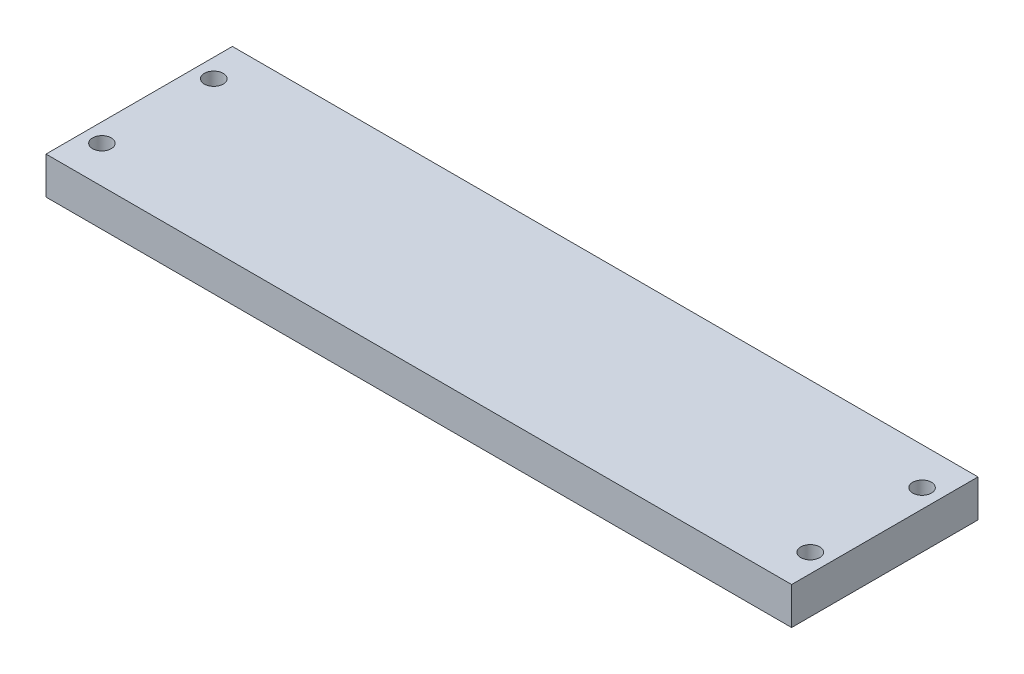
ISO-10303-21;
HEADER;
FILE_DESCRIPTION(('STEP AP214'),'2;1');
FILE_NAME('part.step','',(''),(''),'','','');
FILE_SCHEMA(('AUTOMOTIVE_DESIGN { 1 0 10303 214 1 1 1 1 }'));
ENDSEC;
DATA;
#1=APPLICATION_CONTEXT('core data for automotive mechanical design processes');
#2=APPLICATION_PROTOCOL_DEFINITION('international standard','automotive_design',2000,#1);
#3=PRODUCT_CONTEXT('',#1,'mechanical');
#4=PRODUCT('Part','Part','',(#3));
#5=PRODUCT_RELATED_PRODUCT_CATEGORY('part','',(#4));
#6=PRODUCT_DEFINITION_FORMATION('','',#4);
#7=PRODUCT_DEFINITION_CONTEXT('part definition',#1,'design');
#8=PRODUCT_DEFINITION('design','',#6,#7);
#9=PRODUCT_DEFINITION_SHAPE('','',#8);
#10=(LENGTH_UNIT() NAMED_UNIT(*) SI_UNIT(.MILLI.,.METRE.));
#11=(NAMED_UNIT(*) PLANE_ANGLE_UNIT() SI_UNIT($,.RADIAN.));
#12=(NAMED_UNIT(*) SI_UNIT($,.STERADIAN.) SOLID_ANGLE_UNIT());
#13=UNCERTAINTY_MEASURE_WITH_UNIT(LENGTH_MEASURE(1.E-05),#10,'distance_accuracy_value','');
#14=(GEOMETRIC_REPRESENTATION_CONTEXT(3) GLOBAL_UNCERTAINTY_ASSIGNED_CONTEXT((#13)) GLOBAL_UNIT_ASSIGNED_CONTEXT((#10,
#11,#12)) REPRESENTATION_CONTEXT('',''));
#15=CARTESIAN_POINT('',(0.,0.,0.));
#16=DIRECTION('',(0.,0.,1.));
#17=DIRECTION('',(1.,0.,0.));
#18=AXIS2_PLACEMENT_3D('',#15,#16,#17);
#19=CARTESIAN_POINT('',(63.5,3.175,15.875));
#20=DIRECTION('',(-1.,0.,0.));
#21=DIRECTION('',(0.,0.,1.));
#22=AXIS2_PLACEMENT_3D('',#19,#20,#21);
#23=PLANE('',#22);
#24=DIRECTION('',(0.,0.,-1.));
#25=VECTOR('',#24,1.);
#26=CARTESIAN_POINT('',(63.5,-3.175,15.875));
#27=LINE('',#26,#25);
#28=CARTESIAN_POINT('',(63.5,-3.175,15.875));
#29=VERTEX_POINT('',#28);
#30=CARTESIAN_POINT('',(63.5,-3.175,-15.875));
#31=VERTEX_POINT('',#30);
#32=EDGE_CURVE('E105',#29,#31,#27,.T.);
#33=ORIENTED_EDGE('',*,*,#32,.T.);
#34=DIRECTION('',(0.,-1.,0.));
#35=VECTOR('',#34,1.);
#36=CARTESIAN_POINT('',(63.5,3.175,-15.875));
#37=LINE('',#36,#35);
#38=CARTESIAN_POINT('',(63.5,3.175,-15.875));
#39=VERTEX_POINT('',#38);
#40=EDGE_CURVE('E11',#39,#31,#37,.T.);
#41=ORIENTED_EDGE('',*,*,#40,.F.);
#42=DIRECTION('',(0.,0.,-1.));
#43=VECTOR('',#42,1.);
#44=CARTESIAN_POINT('',(63.5,3.175,15.875));
#45=LINE('',#44,#43);
#46=CARTESIAN_POINT('',(63.5,3.175,15.875));
#47=VERTEX_POINT('',#46);
#48=EDGE_CURVE('E91',#47,#39,#45,.T.);
#49=ORIENTED_EDGE('',*,*,#48,.F.);
#50=DIRECTION('',(0.,-1.,0.));
#51=VECTOR('',#50,1.);
#52=CARTESIAN_POINT('',(63.5,3.175,15.875));
#53=LINE('',#52,#51);
#54=EDGE_CURVE('E101',#47,#29,#53,.T.);
#55=ORIENTED_EDGE('',*,*,#54,.T.);
#56=EDGE_LOOP('',(#33,#41,#49,#55));
#57=FACE_BOUND('',#56,.T.);
#58=ADVANCED_FACE('F38',(#57),#23,.F.);
#59=CARTESIAN_POINT('',(-63.5,3.175,-15.875));
#60=DIRECTION('',(0.,0.,1.));
#61=DIRECTION('',(1.,0.,0.));
#62=AXIS2_PLACEMENT_3D('',#59,#60,#61);
#63=PLANE('',#62);
#64=DIRECTION('',(-1.,0.,0.));
#65=VECTOR('',#64,1.);
#66=CARTESIAN_POINT('',(-63.5,-3.175,-15.875));
#67=LINE('',#66,#65);
#68=CARTESIAN_POINT('',(-63.5,-3.175,-15.875));
#69=VERTEX_POINT('',#68);
#70=EDGE_CURVE('E95',#31,#69,#67,.T.);
#71=ORIENTED_EDGE('',*,*,#70,.T.);
#72=DIRECTION('',(0.,-1.,0.));
#73=VECTOR('',#72,1.);
#74=CARTESIAN_POINT('',(-63.5,3.175,-15.875));
#75=LINE('',#74,#73);
#76=CARTESIAN_POINT('',(-63.5,3.175,-15.875));
#77=VERTEX_POINT('',#76);
#78=EDGE_CURVE('E47',#77,#69,#75,.T.);
#79=ORIENTED_EDGE('',*,*,#78,.F.);
#80=DIRECTION('',(-1.,0.,0.));
#81=VECTOR('',#80,1.);
#82=CARTESIAN_POINT('',(-63.5,3.175,-15.875));
#83=LINE('',#82,#81);
#84=EDGE_CURVE('E86',#39,#77,#83,.T.);
#85=ORIENTED_EDGE('',*,*,#84,.F.);
#86=ORIENTED_EDGE('',*,*,#40,.T.);
#87=EDGE_LOOP('',(#71,#79,#85,#86));
#88=FACE_BOUND('',#87,.T.);
#89=ADVANCED_FACE('F94',(#88),#63,.F.);
#90=CARTESIAN_POINT('',(-63.5,3.175,15.875));
#91=DIRECTION('',(1.,0.,0.));
#92=DIRECTION('',(0.,0.,-1.));
#93=AXIS2_PLACEMENT_3D('',#90,#91,#92);
#94=PLANE('',#93);
#95=DIRECTION('',(0.,0.,1.));
#96=VECTOR('',#95,1.);
#97=CARTESIAN_POINT('',(-63.5,-3.175,15.875));
#98=LINE('',#97,#96);
#99=CARTESIAN_POINT('',(-63.5,-3.175,15.875));
#100=VERTEX_POINT('',#99);
#101=EDGE_CURVE('E73',#69,#100,#98,.T.);
#102=ORIENTED_EDGE('',*,*,#101,.T.);
#103=DIRECTION('',(0.,-1.,0.));
#104=VECTOR('',#103,1.);
#105=CARTESIAN_POINT('',(-63.5,3.175,15.875));
#106=LINE('',#105,#104);
#107=CARTESIAN_POINT('',(-63.5,3.175,15.875));
#108=VERTEX_POINT('',#107);
#109=EDGE_CURVE('E96',#108,#100,#106,.T.);
#110=ORIENTED_EDGE('',*,*,#109,.F.);
#111=DIRECTION('',(0.,0.,1.));
#112=VECTOR('',#111,1.);
#113=CARTESIAN_POINT('',(-63.5,3.175,15.875));
#114=LINE('',#113,#112);
#115=EDGE_CURVE('E89',#77,#108,#114,.T.);
#116=ORIENTED_EDGE('',*,*,#115,.F.);
#117=ORIENTED_EDGE('',*,*,#78,.T.);
#118=EDGE_LOOP('',(#102,#110,#116,#117));
#119=FACE_BOUND('',#118,.T.);
#120=ADVANCED_FACE('F98',(#119),#94,.F.);
#121=CARTESIAN_POINT('',(-63.5,3.175,15.875));
#122=DIRECTION('',(0.,0.,-1.));
#123=DIRECTION('',(-1.,0.,0.));
#124=AXIS2_PLACEMENT_3D('',#121,#122,#123);
#125=PLANE('',#124);
#126=DIRECTION('',(1.,0.,0.));
#127=VECTOR('',#126,1.);
#128=CARTESIAN_POINT('',(-63.5,-3.175,15.875));
#129=LINE('',#128,#127);
#130=EDGE_CURVE('E79',#100,#29,#129,.T.);
#131=ORIENTED_EDGE('',*,*,#130,.T.);
#132=ORIENTED_EDGE('',*,*,#54,.F.);
#133=DIRECTION('',(1.,0.,0.));
#134=VECTOR('',#133,1.);
#135=CARTESIAN_POINT('',(-63.5,3.175,15.875));
#136=LINE('',#135,#134);
#137=EDGE_CURVE('E56',#108,#47,#136,.T.);
#138=ORIENTED_EDGE('',*,*,#137,.F.);
#139=ORIENTED_EDGE('',*,*,#109,.T.);
#140=EDGE_LOOP('',(#131,#132,#138,#139));
#141=FACE_BOUND('',#140,.T.);
#142=ADVANCED_FACE('F162',(#141),#125,.F.);
#143=CARTESIAN_POINT('',(0.,3.175,0.));
#144=DIRECTION('',(0.,-1.,0.));
#145=DIRECTION('',(0.,0.,-1.));
#146=AXIS2_PLACEMENT_3D('',#143,#144,#145);
#147=PLANE('',#146);
#148=CARTESIAN_POINT('',(-60.325,3.175,9.525));
#149=DIRECTION('',(0.,-1.,0.));
#150=DIRECTION('',(0.,0.,-1.));
#151=AXIS2_PLACEMENT_3D('',#148,#149,#150);
#152=CIRCLE('',#151,1.6);
#153=CARTESIAN_POINT('',(-60.325,3.175,7.92500000000001));
#154=VERTEX_POINT('',#153);
#155=EDGE_CURVE('E41',#154,#154,#152,.T.);
#156=ORIENTED_EDGE('',*,*,#155,.T.);
#157=EDGE_LOOP('',(#156));
#158=FACE_BOUND('',#157,.T.);
#159=CARTESIAN_POINT('',(-60.325,3.175,-9.525));
#160=DIRECTION('',(0.,-1.,0.));
#161=DIRECTION('',(0.,0.,-1.));
#162=AXIS2_PLACEMENT_3D('',#159,#160,#161);
#163=CIRCLE('',#162,1.6);
#164=CARTESIAN_POINT('',(-60.325,3.175,-11.125));
#165=VERTEX_POINT('',#164);
#166=EDGE_CURVE('E121',#165,#165,#163,.T.);
#167=ORIENTED_EDGE('',*,*,#166,.T.);
#168=EDGE_LOOP('',(#167));
#169=FACE_BOUND('',#168,.T.);
#170=CARTESIAN_POINT('',(60.325,3.175,9.525));
#171=DIRECTION('',(0.,-1.,0.));
#172=DIRECTION('',(0.,0.,-1.));
#173=AXIS2_PLACEMENT_3D('',#170,#171,#172);
#174=CIRCLE('',#173,1.6);
#175=CARTESIAN_POINT('',(60.325,3.175,7.92500000000001));
#176=VERTEX_POINT('',#175);
#177=EDGE_CURVE('E117',#176,#176,#174,.T.);
#178=ORIENTED_EDGE('',*,*,#177,.T.);
#179=EDGE_LOOP('',(#178));
#180=FACE_BOUND('',#179,.T.);
#181=CARTESIAN_POINT('',(60.325,3.175,-9.525));
#182=DIRECTION('',(0.,-1.,0.));
#183=DIRECTION('',(0.,0.,-1.));
#184=AXIS2_PLACEMENT_3D('',#181,#182,#183);
#185=CIRCLE('',#184,1.6);
#186=CARTESIAN_POINT('',(60.325,3.175,-11.125));
#187=VERTEX_POINT('',#186);
#188=EDGE_CURVE('E108',#187,#187,#185,.T.);
#189=ORIENTED_EDGE('',*,*,#188,.T.);
#190=EDGE_LOOP('',(#189));
#191=FACE_BOUND('',#190,.T.);
#192=ORIENTED_EDGE('',*,*,#48,.T.);
#193=ORIENTED_EDGE('',*,*,#84,.T.);
#194=ORIENTED_EDGE('',*,*,#115,.T.);
#195=ORIENTED_EDGE('',*,*,#137,.T.);
#196=EDGE_LOOP('',(#192,#193,#194,#195));
#197=FACE_BOUND('',#196,.T.);
#198=ADVANCED_FACE('F87',(#158,#169,#180,#191,#197),#147,.F.);
#199=CARTESIAN_POINT('',(0.,-3.175,0.));
#200=DIRECTION('',(0.,-1.,0.));
#201=DIRECTION('',(0.,0.,-1.));
#202=AXIS2_PLACEMENT_3D('',#199,#200,#201);
#203=PLANE('',#202);
#204=CARTESIAN_POINT('',(-60.325,-3.175,9.525));
#205=DIRECTION('',(0.,-1.,0.));
#206=DIRECTION('',(0.,0.,-1.));
#207=AXIS2_PLACEMENT_3D('',#204,#205,#206);
#208=CIRCLE('',#207,3.15);
#209=CARTESIAN_POINT('',(-60.325,-3.175,6.375));
#210=VERTEX_POINT('',#209);
#211=EDGE_CURVE('E280',#210,#210,#208,.T.);
#212=ORIENTED_EDGE('',*,*,#211,.F.);
#213=EDGE_LOOP('',(#212));
#214=FACE_BOUND('',#213,.T.);
#215=CARTESIAN_POINT('',(-60.325,-3.175,-9.525));
#216=DIRECTION('',(0.,-1.,0.));
#217=DIRECTION('',(0.,0.,-1.));
#218=AXIS2_PLACEMENT_3D('',#215,#216,#217);
#219=CIRCLE('',#218,3.15);
#220=CARTESIAN_POINT('',(-60.325,-3.175,-12.675));
#221=VERTEX_POINT('',#220);
#222=EDGE_CURVE('E130',#221,#221,#219,.T.);
#223=ORIENTED_EDGE('',*,*,#222,.F.);
#224=EDGE_LOOP('',(#223));
#225=FACE_BOUND('',#224,.T.);
#226=CARTESIAN_POINT('',(60.325,-3.175,9.525));
#227=DIRECTION('',(0.,-1.,0.));
#228=DIRECTION('',(0.,0.,-1.));
#229=AXIS2_PLACEMENT_3D('',#226,#227,#228);
#230=CIRCLE('',#229,3.15);
#231=CARTESIAN_POINT('',(60.325,-3.175,6.375));
#232=VERTEX_POINT('',#231);
#233=EDGE_CURVE('E123',#232,#232,#230,.T.);
#234=ORIENTED_EDGE('',*,*,#233,.F.);
#235=EDGE_LOOP('',(#234));
#236=FACE_BOUND('',#235,.T.);
#237=CARTESIAN_POINT('',(60.325,-3.175,-9.525));
#238=DIRECTION('',(0.,-1.,0.));
#239=DIRECTION('',(0.,0.,-1.));
#240=AXIS2_PLACEMENT_3D('',#237,#238,#239);
#241=CIRCLE('',#240,3.15);
#242=CARTESIAN_POINT('',(60.325,-3.175,-12.675));
#243=VERTEX_POINT('',#242);
#244=EDGE_CURVE('E119',#243,#243,#241,.T.);
#245=ORIENTED_EDGE('',*,*,#244,.F.);
#246=EDGE_LOOP('',(#245));
#247=FACE_BOUND('',#246,.T.);
#248=ORIENTED_EDGE('',*,*,#32,.F.);
#249=ORIENTED_EDGE('',*,*,#130,.F.);
#250=ORIENTED_EDGE('',*,*,#101,.F.);
#251=ORIENTED_EDGE('',*,*,#70,.F.);
#252=EDGE_LOOP('',(#248,#249,#250,#251));
#253=FACE_BOUND('',#252,.T.);
#254=ADVANCED_FACE('F155',(#214,#225,#236,#247,#253),#203,.T.);
#255=CARTESIAN_POINT('',(60.325,-3.175,-9.525));
#256=DIRECTION('',(0.,-1.,0.));
#257=DIRECTION('',(0.,0.,-1.));
#258=AXIS2_PLACEMENT_3D('',#255,#256,#257);
#259=CYLINDRICAL_SURFACE('',#258,1.6);
#260=CARTESIAN_POINT('',(60.325,-1.625,-9.525));
#261=DIRECTION('',(0.,-1.,0.));
#262=DIRECTION('',(0.,0.,-1.));
#263=AXIS2_PLACEMENT_3D('',#260,#261,#262);
#264=CIRCLE('',#263,1.6);
#265=CARTESIAN_POINT('',(60.325,-1.625,-11.125));
#266=VERTEX_POINT('',#265);
#267=EDGE_CURVE('E116',#266,#266,#264,.T.);
#268=ORIENTED_EDGE('',*,*,#267,.T.);
#269=EDGE_LOOP('',(#268));
#270=FACE_BOUND('',#269,.T.);
#271=ORIENTED_EDGE('',*,*,#188,.F.);
#272=EDGE_LOOP('',(#271));
#273=FACE_BOUND('',#272,.T.);
#274=ADVANCED_FACE('F145',(#270,#273),#259,.F.);
#275=CARTESIAN_POINT('',(60.325,-3.175,-9.525));
#276=DIRECTION('',(0.,-1.,0.));
#277=DIRECTION('',(0.,0.,-1.));
#278=AXIS2_PLACEMENT_3D('',#275,#276,#277);
#279=CONICAL_SURFACE('',#278,3.15,0.785398163397448);
#280=ORIENTED_EDGE('',*,*,#267,.F.);
#281=EDGE_LOOP('',(#280));
#282=FACE_BOUND('',#281,.T.);
#283=ORIENTED_EDGE('',*,*,#244,.T.);
#284=EDGE_LOOP('',(#283));
#285=FACE_BOUND('',#284,.T.);
#286=ADVANCED_FACE('F148',(#282,#285),#279,.F.);
#287=CARTESIAN_POINT('',(60.325,-3.175,9.525));
#288=DIRECTION('',(0.,-1.,0.));
#289=DIRECTION('',(0.,0.,-1.));
#290=AXIS2_PLACEMENT_3D('',#287,#288,#289);
#291=CYLINDRICAL_SURFACE('',#290,1.6);
#292=CARTESIAN_POINT('',(60.325,-1.625,9.525));
#293=DIRECTION('',(0.,-1.,0.));
#294=DIRECTION('',(0.,0.,-1.));
#295=AXIS2_PLACEMENT_3D('',#292,#293,#294);
#296=CIRCLE('',#295,1.6);
#297=CARTESIAN_POINT('',(60.325,-1.625,7.92500000000001));
#298=VERTEX_POINT('',#297);
#299=EDGE_CURVE('E120',#298,#298,#296,.T.);
#300=ORIENTED_EDGE('',*,*,#299,.T.);
#301=EDGE_LOOP('',(#300));
#302=FACE_BOUND('',#301,.T.);
#303=ORIENTED_EDGE('',*,*,#177,.F.);
#304=EDGE_LOOP('',(#303));
#305=FACE_BOUND('',#304,.T.);
#306=ADVANCED_FACE('F151',(#302,#305),#291,.F.);
#307=CARTESIAN_POINT('',(60.325,-3.175,9.525));
#308=DIRECTION('',(0.,-1.,0.));
#309=DIRECTION('',(0.,0.,-1.));
#310=AXIS2_PLACEMENT_3D('',#307,#308,#309);
#311=CONICAL_SURFACE('',#310,3.15,0.785398163397448);
#312=ORIENTED_EDGE('',*,*,#299,.F.);
#313=EDGE_LOOP('',(#312));
#314=FACE_BOUND('',#313,.T.);
#315=ORIENTED_EDGE('',*,*,#233,.T.);
#316=EDGE_LOOP('',(#315));
#317=FACE_BOUND('',#316,.T.);
#318=ADVANCED_FACE('F221',(#314,#317),#311,.F.);
#319=CARTESIAN_POINT('',(-60.325,-3.175,-9.525));
#320=DIRECTION('',(0.,-1.,0.));
#321=DIRECTION('',(0.,0.,-1.));
#322=AXIS2_PLACEMENT_3D('',#319,#320,#321);
#323=CYLINDRICAL_SURFACE('',#322,1.6);
#324=CARTESIAN_POINT('',(-60.325,-1.625,-9.525));
#325=DIRECTION('',(0.,-1.,0.));
#326=DIRECTION('',(0.,0.,-1.));
#327=AXIS2_PLACEMENT_3D('',#324,#325,#326);
#328=CIRCLE('',#327,1.6);
#329=CARTESIAN_POINT('',(-60.325,-1.625,-11.125));
#330=VERTEX_POINT('',#329);
#331=EDGE_CURVE('E124',#330,#330,#328,.T.);
#332=ORIENTED_EDGE('',*,*,#331,.T.);
#333=EDGE_LOOP('',(#332));
#334=FACE_BOUND('',#333,.T.);
#335=ORIENTED_EDGE('',*,*,#166,.F.);
#336=EDGE_LOOP('',(#335));
#337=FACE_BOUND('',#336,.T.);
#338=ADVANCED_FACE('F231',(#334,#337),#323,.F.);
#339=CARTESIAN_POINT('',(-60.325,-3.175,-9.525));
#340=DIRECTION('',(0.,-1.,0.));
#341=DIRECTION('',(0.,0.,-1.));
#342=AXIS2_PLACEMENT_3D('',#339,#340,#341);
#343=CONICAL_SURFACE('',#342,3.15,0.785398163397448);
#344=ORIENTED_EDGE('',*,*,#331,.F.);
#345=EDGE_LOOP('',(#344));
#346=FACE_BOUND('',#345,.T.);
#347=ORIENTED_EDGE('',*,*,#222,.T.);
#348=EDGE_LOOP('',(#347));
#349=FACE_BOUND('',#348,.T.);
#350=ADVANCED_FACE('F241',(#346,#349),#343,.F.);
#351=CARTESIAN_POINT('',(-60.325,-3.175,9.525));
#352=DIRECTION('',(0.,-1.,0.));
#353=DIRECTION('',(0.,0.,-1.));
#354=AXIS2_PLACEMENT_3D('',#351,#352,#353);
#355=CYLINDRICAL_SURFACE('',#354,1.6);
#356=CARTESIAN_POINT('',(-60.325,-1.625,9.525));
#357=DIRECTION('',(0.,-1.,0.));
#358=DIRECTION('',(0.,0.,-1.));
#359=AXIS2_PLACEMENT_3D('',#356,#357,#358);
#360=CIRCLE('',#359,1.6);
#361=CARTESIAN_POINT('',(-60.325,-1.625,7.92500000000001));
#362=VERTEX_POINT('',#361);
#363=EDGE_CURVE('E277',#362,#362,#360,.T.);
#364=ORIENTED_EDGE('',*,*,#363,.T.);
#365=EDGE_LOOP('',(#364));
#366=FACE_BOUND('',#365,.T.);
#367=ORIENTED_EDGE('',*,*,#155,.F.);
#368=EDGE_LOOP('',(#367));
#369=FACE_BOUND('',#368,.T.);
#370=ADVANCED_FACE('F250',(#366,#369),#355,.F.);
#371=CARTESIAN_POINT('',(-60.325,-3.175,9.525));
#372=DIRECTION('',(0.,-1.,0.));
#373=DIRECTION('',(0.,0.,-1.));
#374=AXIS2_PLACEMENT_3D('',#371,#372,#373);
#375=CONICAL_SURFACE('',#374,3.15,0.785398163397448);
#376=ORIENTED_EDGE('',*,*,#363,.F.);
#377=EDGE_LOOP('',(#376));
#378=FACE_BOUND('',#377,.T.);
#379=ORIENTED_EDGE('',*,*,#211,.T.);
#380=EDGE_LOOP('',(#379));
#381=FACE_BOUND('',#380,.T.);
#382=ADVANCED_FACE('F260',(#378,#381),#375,.F.);
#383=CLOSED_SHELL('',(#58,#89,#120,#142,#198,#254,#274,#286,#306,#318,#338,#350,#370,#382));
#384=MANIFOLD_SOLID_BREP('B2',#383);
#385=ADVANCED_BREP_SHAPE_REPRESENTATION('',(#18,#384),#14);
#386=SHAPE_DEFINITION_REPRESENTATION(#9,#385);
ENDSEC;
END-ISO-10303-21;
